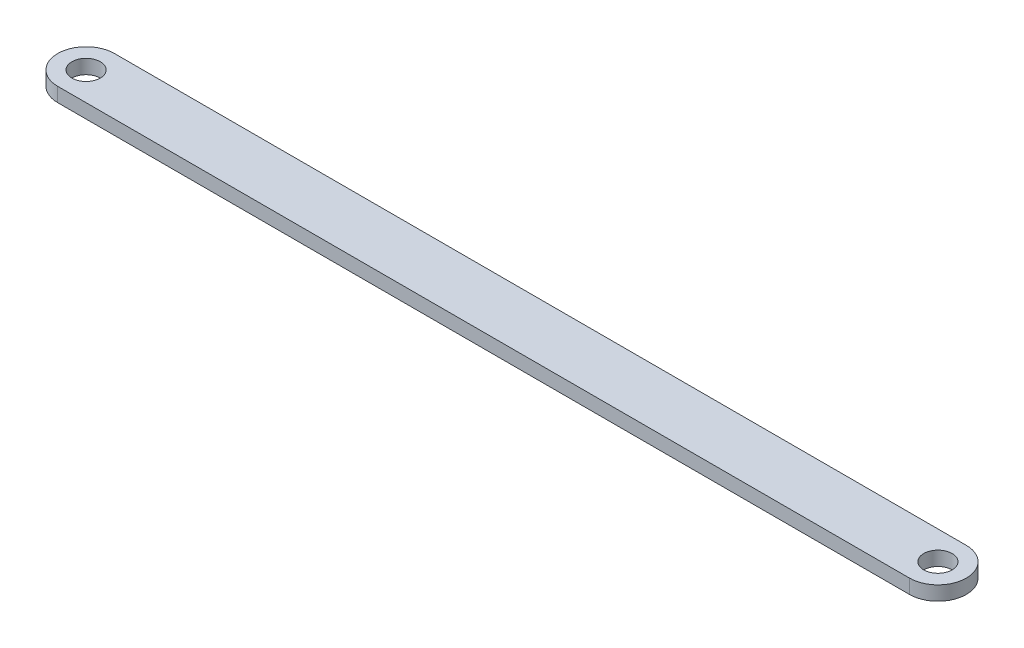
ISO-10303-21;
HEADER;
FILE_DESCRIPTION(('STEP AP214'),'2;1');
FILE_NAME('part.step','',(''),(''),'','','');
FILE_SCHEMA(('AUTOMOTIVE_DESIGN { 1 0 10303 214 1 1 1 1 }'));
ENDSEC;
DATA;
#1=APPLICATION_CONTEXT('core data for automotive mechanical design processes');
#2=APPLICATION_PROTOCOL_DEFINITION('international standard','automotive_design',2000,#1);
#3=PRODUCT_CONTEXT('',#1,'mechanical');
#4=PRODUCT('Part','Part','',(#3));
#5=PRODUCT_RELATED_PRODUCT_CATEGORY('part','',(#4));
#6=PRODUCT_DEFINITION_FORMATION('','',#4);
#7=PRODUCT_DEFINITION_CONTEXT('part definition',#1,'design');
#8=PRODUCT_DEFINITION('design','',#6,#7);
#9=PRODUCT_DEFINITION_SHAPE('','',#8);
#10=(LENGTH_UNIT() NAMED_UNIT(*) SI_UNIT(.MILLI.,.METRE.));
#11=(NAMED_UNIT(*) PLANE_ANGLE_UNIT() SI_UNIT($,.RADIAN.));
#12=(NAMED_UNIT(*) SI_UNIT($,.STERADIAN.) SOLID_ANGLE_UNIT());
#13=UNCERTAINTY_MEASURE_WITH_UNIT(LENGTH_MEASURE(1.E-05),#10,'distance_accuracy_value','');
#14=(GEOMETRIC_REPRESENTATION_CONTEXT(3) GLOBAL_UNCERTAINTY_ASSIGNED_CONTEXT((#13)) GLOBAL_UNIT_ASSIGNED_CONTEXT((#10,
#11,#12)) REPRESENTATION_CONTEXT('',''));
#15=CARTESIAN_POINT('',(0.,0.,0.));
#16=DIRECTION('',(0.,0.,1.));
#17=DIRECTION('',(1.,0.,0.));
#18=AXIS2_PLACEMENT_3D('',#15,#16,#17);
#19=CARTESIAN_POINT('',(-150.,5.,0.));
#20=DIRECTION('',(0.,1.,0.));
#21=DIRECTION('',(0.,0.,1.));
#22=AXIS2_PLACEMENT_3D('',#19,#20,#21);
#23=PLANE('',#22);
#24=CARTESIAN_POINT('',(-150.,5.,0.));
#25=DIRECTION('',(0.,1.,0.));
#26=DIRECTION('',(0.,0.,1.));
#27=AXIS2_PLACEMENT_3D('',#24,#25,#26);
#28=CIRCLE('',#27,5.00000000000002);
#29=CARTESIAN_POINT('',(-150.,5.,5.00000000000002));
#30=VERTEX_POINT('',#29);
#31=EDGE_CURVE('E106',#30,#30,#28,.T.);
#32=ORIENTED_EDGE('',*,*,#31,.F.);
#33=EDGE_LOOP('',(#32));
#34=FACE_BOUND('',#33,.T.);
#35=CARTESIAN_POINT('',(-150.,5.,0.));
#36=DIRECTION('',(0.,1.,0.));
#37=DIRECTION('',(0.,0.,1.));
#38=AXIS2_PLACEMENT_3D('',#35,#36,#37);
#39=CIRCLE('',#38,10.);
#40=CARTESIAN_POINT('',(-150.,5.,-10.));
#41=VERTEX_POINT('',#40);
#42=CARTESIAN_POINT('',(-150.,5.,10.));
#43=VERTEX_POINT('',#42);
#44=EDGE_CURVE('E91',#41,#43,#39,.T.);
#45=ORIENTED_EDGE('',*,*,#44,.T.);
#46=DIRECTION('',(1.,0.,0.));
#47=VECTOR('',#46,1.);
#48=CARTESIAN_POINT('',(-150.,5.,10.));
#49=LINE('',#48,#47);
#50=CARTESIAN_POINT('',(150.,5.,10.));
#51=VERTEX_POINT('',#50);
#52=EDGE_CURVE('E86',#43,#51,#49,.T.);
#53=ORIENTED_EDGE('',*,*,#52,.T.);
#54=CARTESIAN_POINT('',(150.,5.,0.));
#55=DIRECTION('',(0.,1.,0.));
#56=DIRECTION('',(0.,0.,1.));
#57=AXIS2_PLACEMENT_3D('',#54,#55,#56);
#58=CIRCLE('',#57,10.);
#59=CARTESIAN_POINT('',(150.,5.,-10.));
#60=VERTEX_POINT('',#59);
#61=EDGE_CURVE('E89',#51,#60,#58,.T.);
#62=ORIENTED_EDGE('',*,*,#61,.T.);
#63=DIRECTION('',(-1.,0.,0.));
#64=VECTOR('',#63,1.);
#65=CARTESIAN_POINT('',(-150.,5.,-10.));
#66=LINE('',#65,#64);
#67=EDGE_CURVE('E56',#60,#41,#66,.T.);
#68=ORIENTED_EDGE('',*,*,#67,.T.);
#69=EDGE_LOOP('',(#45,#53,#62,#68));
#70=FACE_BOUND('',#69,.T.);
#71=CARTESIAN_POINT('',(150.,5.,0.));
#72=DIRECTION('',(0.,1.,0.));
#73=DIRECTION('',(0.,0.,1.));
#74=AXIS2_PLACEMENT_3D('',#71,#72,#73);
#75=CIRCLE('',#74,5.00000000000002);
#76=CARTESIAN_POINT('',(150.,5.,5.00000000000002));
#77=VERTEX_POINT('',#76);
#78=EDGE_CURVE('E121',#77,#77,#75,.T.);
#79=ORIENTED_EDGE('',*,*,#78,.F.);
#80=EDGE_LOOP('',(#79));
#81=FACE_BOUND('',#80,.T.);
#82=ADVANCED_FACE('F39',(#34,#70,#81),#23,.T.);
#83=CARTESIAN_POINT('',(-150.,0.,0.));
#84=DIRECTION('',(0.,1.,0.));
#85=DIRECTION('',(0.,0.,1.));
#86=AXIS2_PLACEMENT_3D('',#83,#84,#85);
#87=PLANE('',#86);
#88=CARTESIAN_POINT('',(-150.,0.,0.));
#89=DIRECTION('',(0.,1.,0.));
#90=DIRECTION('',(0.,0.,1.));
#91=AXIS2_PLACEMENT_3D('',#88,#89,#90);
#92=CIRCLE('',#91,10.);
#93=CARTESIAN_POINT('',(-150.,0.,-10.));
#94=VERTEX_POINT('',#93);
#95=CARTESIAN_POINT('',(-150.,0.,10.));
#96=VERTEX_POINT('',#95);
#97=EDGE_CURVE('E103',#94,#96,#92,.T.);
#98=ORIENTED_EDGE('',*,*,#97,.F.);
#99=DIRECTION('',(-1.,0.,0.));
#100=VECTOR('',#99,1.);
#101=CARTESIAN_POINT('',(-150.,0.,-10.));
#102=LINE('',#101,#100);
#103=CARTESIAN_POINT('',(150.,0.,-10.));
#104=VERTEX_POINT('',#103);
#105=EDGE_CURVE('E79',#104,#94,#102,.T.);
#106=ORIENTED_EDGE('',*,*,#105,.F.);
#107=CARTESIAN_POINT('',(150.,0.,0.));
#108=DIRECTION('',(0.,1.,0.));
#109=DIRECTION('',(0.,0.,1.));
#110=AXIS2_PLACEMENT_3D('',#107,#108,#109);
#111=CIRCLE('',#110,10.);
#112=CARTESIAN_POINT('',(150.,0.,10.));
#113=VERTEX_POINT('',#112);
#114=EDGE_CURVE('E73',#113,#104,#111,.T.);
#115=ORIENTED_EDGE('',*,*,#114,.F.);
#116=DIRECTION('',(1.,0.,0.));
#117=VECTOR('',#116,1.);
#118=CARTESIAN_POINT('',(-150.,0.,10.));
#119=LINE('',#118,#117);
#120=EDGE_CURVE('E95',#96,#113,#119,.T.);
#121=ORIENTED_EDGE('',*,*,#120,.F.);
#122=EDGE_LOOP('',(#98,#106,#115,#121));
#123=FACE_BOUND('',#122,.T.);
#124=CARTESIAN_POINT('',(-150.,0.,0.));
#125=DIRECTION('',(0.,1.,0.));
#126=DIRECTION('',(0.,0.,1.));
#127=AXIS2_PLACEMENT_3D('',#124,#125,#126);
#128=CIRCLE('',#127,5.00000000000002);
#129=CARTESIAN_POINT('',(-150.,0.,5.00000000000002));
#130=VERTEX_POINT('',#129);
#131=EDGE_CURVE('E118',#130,#130,#128,.T.);
#132=ORIENTED_EDGE('',*,*,#131,.T.);
#133=EDGE_LOOP('',(#132));
#134=FACE_BOUND('',#133,.T.);
#135=CARTESIAN_POINT('',(150.,0.,0.));
#136=DIRECTION('',(0.,1.,0.));
#137=DIRECTION('',(0.,0.,1.));
#138=AXIS2_PLACEMENT_3D('',#135,#136,#137);
#139=CIRCLE('',#138,5.00000000000002);
#140=CARTESIAN_POINT('',(150.,0.,5.00000000000002));
#141=VERTEX_POINT('',#140);
#142=EDGE_CURVE('E124',#141,#141,#139,.T.);
#143=ORIENTED_EDGE('',*,*,#142,.T.);
#144=EDGE_LOOP('',(#143));
#145=FACE_BOUND('',#144,.T.);
#146=ADVANCED_FACE('F114',(#123,#134,#145),#87,.F.);
#147=CARTESIAN_POINT('',(-150.,5.,0.));
#148=DIRECTION('',(0.,-1.,0.));
#149=DIRECTION('',(0.,0.,-1.));
#150=AXIS2_PLACEMENT_3D('',#147,#148,#149);
#151=CYLINDRICAL_SURFACE('',#150,10.);
#152=ORIENTED_EDGE('',*,*,#97,.T.);
#153=DIRECTION('',(0.,-1.,0.));
#154=VECTOR('',#153,1.);
#155=CARTESIAN_POINT('',(-150.,5.,10.));
#156=LINE('',#155,#154);
#157=EDGE_CURVE('E11',#43,#96,#156,.T.);
#158=ORIENTED_EDGE('',*,*,#157,.F.);
#159=ORIENTED_EDGE('',*,*,#44,.F.);
#160=DIRECTION('',(0.,-1.,0.));
#161=VECTOR('',#160,1.);
#162=CARTESIAN_POINT('',(-150.,5.,-10.));
#163=LINE('',#162,#161);
#164=EDGE_CURVE('E99',#41,#94,#163,.T.);
#165=ORIENTED_EDGE('',*,*,#164,.T.);
#166=EDGE_LOOP('',(#152,#158,#159,#165));
#167=FACE_BOUND('',#166,.T.);
#168=ADVANCED_FACE('F41',(#167),#151,.T.);
#169=CARTESIAN_POINT('',(-150.,5.,10.));
#170=DIRECTION('',(0.,0.,-1.));
#171=DIRECTION('',(-1.,0.,0.));
#172=AXIS2_PLACEMENT_3D('',#169,#170,#171);
#173=PLANE('',#172);
#174=ORIENTED_EDGE('',*,*,#120,.T.);
#175=DIRECTION('',(0.,-1.,0.));
#176=VECTOR('',#175,1.);
#177=CARTESIAN_POINT('',(150.,5.,10.));
#178=LINE('',#177,#176);
#179=EDGE_CURVE('E48',#51,#113,#178,.T.);
#180=ORIENTED_EDGE('',*,*,#179,.F.);
#181=ORIENTED_EDGE('',*,*,#52,.F.);
#182=ORIENTED_EDGE('',*,*,#157,.T.);
#183=EDGE_LOOP('',(#174,#180,#181,#182));
#184=FACE_BOUND('',#183,.T.);
#185=ADVANCED_FACE('F94',(#184),#173,.F.);
#186=CARTESIAN_POINT('',(150.,5.,0.));
#187=DIRECTION('',(0.,-1.,0.));
#188=DIRECTION('',(0.,0.,-1.));
#189=AXIS2_PLACEMENT_3D('',#186,#187,#188);
#190=CYLINDRICAL_SURFACE('',#189,10.);
#191=ORIENTED_EDGE('',*,*,#114,.T.);
#192=DIRECTION('',(0.,-1.,0.));
#193=VECTOR('',#192,1.);
#194=CARTESIAN_POINT('',(150.,5.,-10.));
#195=LINE('',#194,#193);
#196=EDGE_CURVE('E96',#60,#104,#195,.T.);
#197=ORIENTED_EDGE('',*,*,#196,.F.);
#198=ORIENTED_EDGE('',*,*,#61,.F.);
#199=ORIENTED_EDGE('',*,*,#179,.T.);
#200=EDGE_LOOP('',(#191,#197,#198,#199));
#201=FACE_BOUND('',#200,.T.);
#202=ADVANCED_FACE('F97',(#201),#190,.T.);
#203=CARTESIAN_POINT('',(-150.,5.,-10.));
#204=DIRECTION('',(0.,0.,1.));
#205=DIRECTION('',(1.,0.,0.));
#206=AXIS2_PLACEMENT_3D('',#203,#204,#205);
#207=PLANE('',#206);
#208=ORIENTED_EDGE('',*,*,#105,.T.);
#209=ORIENTED_EDGE('',*,*,#164,.F.);
#210=ORIENTED_EDGE('',*,*,#67,.F.);
#211=ORIENTED_EDGE('',*,*,#196,.T.);
#212=EDGE_LOOP('',(#208,#209,#210,#211));
#213=FACE_BOUND('',#212,.T.);
#214=ADVANCED_FACE('F111',(#213),#207,.F.);
#215=CARTESIAN_POINT('',(-150.,5.,0.));
#216=DIRECTION('',(0.,-1.,0.));
#217=DIRECTION('',(0.,0.,-1.));
#218=AXIS2_PLACEMENT_3D('',#215,#216,#217);
#219=CYLINDRICAL_SURFACE('',#218,5.00000000000002);
#220=ORIENTED_EDGE('',*,*,#31,.T.);
#221=EDGE_LOOP('',(#220));
#222=FACE_BOUND('',#221,.T.);
#223=ORIENTED_EDGE('',*,*,#131,.F.);
#224=EDGE_LOOP('',(#223));
#225=FACE_BOUND('',#224,.T.);
#226=ADVANCED_FACE('F141',(#222,#225),#219,.F.);
#227=CARTESIAN_POINT('',(150.,5.,0.));
#228=DIRECTION('',(0.,-1.,0.));
#229=DIRECTION('',(0.,0.,-1.));
#230=AXIS2_PLACEMENT_3D('',#227,#228,#229);
#231=CYLINDRICAL_SURFACE('',#230,5.00000000000002);
#232=ORIENTED_EDGE('',*,*,#78,.T.);
#233=EDGE_LOOP('',(#232));
#234=FACE_BOUND('',#233,.T.);
#235=ORIENTED_EDGE('',*,*,#142,.F.);
#236=EDGE_LOOP('',(#235));
#237=FACE_BOUND('',#236,.T.);
#238=ADVANCED_FACE('F130',(#234,#237),#231,.F.);
#239=CLOSED_SHELL('',(#82,#146,#168,#185,#202,#214,#226,#238));
#240=MANIFOLD_SOLID_BREP('B2',#239);
#241=ADVANCED_BREP_SHAPE_REPRESENTATION('',(#18,#240),#14);
#242=SHAPE_DEFINITION_REPRESENTATION(#9,#241);
ENDSEC;
END-ISO-10303-21;
